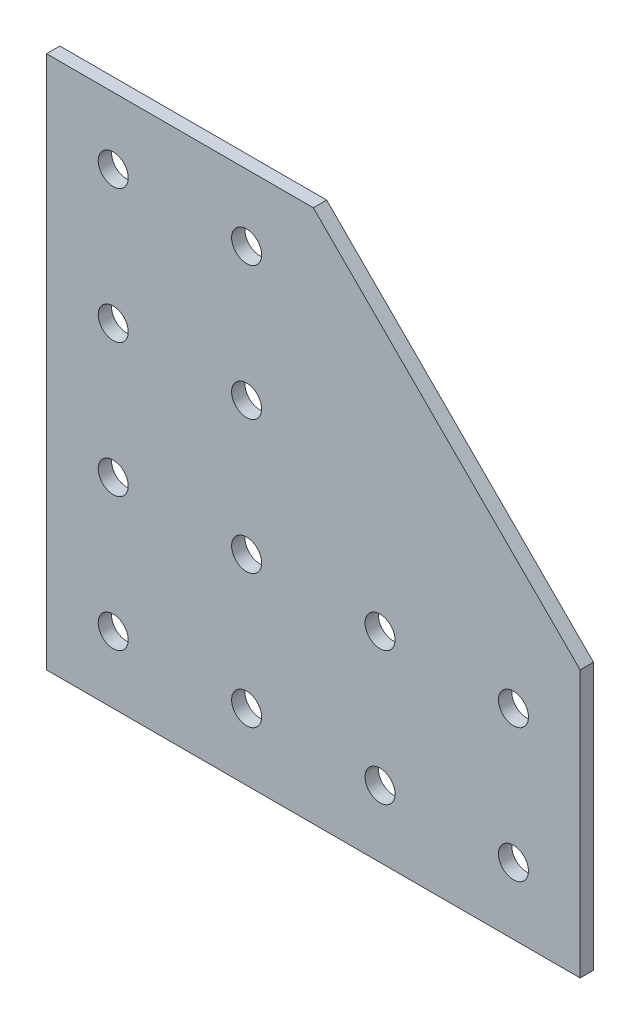
ISO-10303-21;
HEADER;
FILE_DESCRIPTION(('STEP AP214'),'2;1');
FILE_NAME('part.step','',(''),(''),'','','');
FILE_SCHEMA(('AUTOMOTIVE_DESIGN { 1 0 10303 214 1 1 1 1 }'));
ENDSEC;
DATA;
#1=APPLICATION_CONTEXT('core data for automotive mechanical design processes');
#2=APPLICATION_PROTOCOL_DEFINITION('international standard','automotive_design',2000,#1);
#3=PRODUCT_CONTEXT('',#1,'mechanical');
#4=PRODUCT('Part','Part','',(#3));
#5=PRODUCT_RELATED_PRODUCT_CATEGORY('part','',(#4));
#6=PRODUCT_DEFINITION_FORMATION('','',#4);
#7=PRODUCT_DEFINITION_CONTEXT('part definition',#1,'design');
#8=PRODUCT_DEFINITION('design','',#6,#7);
#9=PRODUCT_DEFINITION_SHAPE('','',#8);
#10=(LENGTH_UNIT() NAMED_UNIT(*) SI_UNIT(.MILLI.,.METRE.));
#11=(NAMED_UNIT(*) PLANE_ANGLE_UNIT() SI_UNIT($,.RADIAN.));
#12=(NAMED_UNIT(*) SI_UNIT($,.STERADIAN.) SOLID_ANGLE_UNIT());
#13=UNCERTAINTY_MEASURE_WITH_UNIT(LENGTH_MEASURE(1.E-05),#10,'distance_accuracy_value','');
#14=(GEOMETRIC_REPRESENTATION_CONTEXT(3) GLOBAL_UNCERTAINTY_ASSIGNED_CONTEXT((#13)) GLOBAL_UNIT_ASSIGNED_CONTEXT((#10,
#11,#12)) REPRESENTATION_CONTEXT('',''));
#15=CARTESIAN_POINT('',(0.,0.,0.));
#16=DIRECTION('',(0.,0.,1.));
#17=DIRECTION('',(1.,0.,0.));
#18=AXIS2_PLACEMENT_3D('',#15,#16,#17);
#19=CARTESIAN_POINT('',(80.,0.,2.));
#20=DIRECTION('',(0.,1.,0.));
#21=DIRECTION('',(-1.,0.,0.));
#22=AXIS2_PLACEMENT_3D('',#19,#20,#21);
#23=PLANE('',#22);
#24=DIRECTION('',(1.,0.,0.));
#25=VECTOR('',#24,1.);
#26=CARTESIAN_POINT('',(80.,0.,0.));
#27=LINE('',#26,#25);
#28=CARTESIAN_POINT('',(0.,0.,0.));
#29=VERTEX_POINT('',#28);
#30=CARTESIAN_POINT('',(80.,0.,0.));
#31=VERTEX_POINT('',#30);
#32=EDGE_CURVE('E108',#29,#31,#27,.T.);
#33=ORIENTED_EDGE('',*,*,#32,.T.);
#34=DIRECTION('',(0.,0.,-1.));
#35=VECTOR('',#34,1.);
#36=CARTESIAN_POINT('',(80.,0.,2.));
#37=LINE('',#36,#35);
#38=CARTESIAN_POINT('',(80.,0.,2.));
#39=VERTEX_POINT('',#38);
#40=EDGE_CURVE('E11',#39,#31,#37,.T.);
#41=ORIENTED_EDGE('',*,*,#40,.F.);
#42=DIRECTION('',(1.,0.,0.));
#43=VECTOR('',#42,1.);
#44=CARTESIAN_POINT('',(80.,0.,2.));
#45=LINE('',#44,#43);
#46=CARTESIAN_POINT('',(0.,0.,2.));
#47=VERTEX_POINT('',#46);
#48=EDGE_CURVE('E117',#47,#39,#45,.T.);
#49=ORIENTED_EDGE('',*,*,#48,.F.);
#50=DIRECTION('',(0.,0.,-1.));
#51=VECTOR('',#50,1.);
#52=CARTESIAN_POINT('',(0.,0.,2.));
#53=LINE('',#52,#51);
#54=EDGE_CURVE('E104',#47,#29,#53,.T.);
#55=ORIENTED_EDGE('',*,*,#54,.T.);
#56=EDGE_LOOP('',(#33,#41,#49,#55));
#57=FACE_BOUND('',#56,.T.);
#58=ADVANCED_FACE('F34',(#57),#23,.F.);
#59=CARTESIAN_POINT('',(80.,40.,2.));
#60=DIRECTION('',(-1.,0.,0.));
#61=DIRECTION('',(0.,0.,1.));
#62=AXIS2_PLACEMENT_3D('',#59,#60,#61);
#63=PLANE('',#62);
#64=DIRECTION('',(0.,1.,0.));
#65=VECTOR('',#64,1.);
#66=CARTESIAN_POINT('',(80.,40.,0.));
#67=LINE('',#66,#65);
#68=CARTESIAN_POINT('',(80.,40.,0.));
#69=VERTEX_POINT('',#68);
#70=EDGE_CURVE('E111',#31,#69,#67,.T.);
#71=ORIENTED_EDGE('',*,*,#70,.T.);
#72=DIRECTION('',(0.,0.,-1.));
#73=VECTOR('',#72,1.);
#74=CARTESIAN_POINT('',(80.,40.,2.));
#75=LINE('',#74,#73);
#76=CARTESIAN_POINT('',(80.,40.,2.));
#77=VERTEX_POINT('',#76);
#78=EDGE_CURVE('E42',#77,#69,#75,.T.);
#79=ORIENTED_EDGE('',*,*,#78,.F.);
#80=DIRECTION('',(0.,1.,0.));
#81=VECTOR('',#80,1.);
#82=CARTESIAN_POINT('',(80.,40.,2.));
#83=LINE('',#82,#81);
#84=EDGE_CURVE('E84',#39,#77,#83,.T.);
#85=ORIENTED_EDGE('',*,*,#84,.F.);
#86=ORIENTED_EDGE('',*,*,#40,.T.);
#87=EDGE_LOOP('',(#71,#79,#85,#86));
#88=FACE_BOUND('',#87,.T.);
#89=ADVANCED_FACE('F137',(#88),#63,.F.);
#90=CARTESIAN_POINT('',(40.,80.,2.));
#91=DIRECTION('',(-0.707106781186547,-0.707106781186547,0.));
#92=DIRECTION('',(0.707106781186548,-0.707106781186548,0.));
#93=AXIS2_PLACEMENT_3D('',#90,#91,#92);
#94=PLANE('',#93);
#95=DIRECTION('',(-0.707106781186548,0.707106781186548,0.));
#96=VECTOR('',#95,1.);
#97=CARTESIAN_POINT('',(40.,80.,0.));
#98=LINE('',#97,#96);
#99=CARTESIAN_POINT('',(40.,80.,0.));
#100=VERTEX_POINT('',#99);
#101=EDGE_CURVE('E99',#69,#100,#98,.T.);
#102=ORIENTED_EDGE('',*,*,#101,.T.);
#103=DIRECTION('',(0.,0.,-1.));
#104=VECTOR('',#103,1.);
#105=CARTESIAN_POINT('',(40.,80.,2.));
#106=LINE('',#105,#104);
#107=CARTESIAN_POINT('',(40.,80.,2.));
#108=VERTEX_POINT('',#107);
#109=EDGE_CURVE('E96',#108,#100,#106,.T.);
#110=ORIENTED_EDGE('',*,*,#109,.F.);
#111=DIRECTION('',(-0.707106781186548,0.707106781186548,0.));
#112=VECTOR('',#111,1.);
#113=CARTESIAN_POINT('',(40.,80.,2.));
#114=LINE('',#113,#112);
#115=EDGE_CURVE('E88',#77,#108,#114,.T.);
#116=ORIENTED_EDGE('',*,*,#115,.F.);
#117=ORIENTED_EDGE('',*,*,#78,.T.);
#118=EDGE_LOOP('',(#102,#110,#116,#117));
#119=FACE_BOUND('',#118,.T.);
#120=ADVANCED_FACE('F97',(#119),#94,.F.);
#121=CARTESIAN_POINT('',(0.,80.,2.));
#122=DIRECTION('',(0.,-1.,0.));
#123=DIRECTION('',(0.,0.,-1.));
#124=AXIS2_PLACEMENT_3D('',#121,#122,#123);
#125=PLANE('',#124);
#126=DIRECTION('',(-1.,0.,0.));
#127=VECTOR('',#126,1.);
#128=CARTESIAN_POINT('',(0.,80.,0.));
#129=LINE('',#128,#127);
#130=CARTESIAN_POINT('',(0.,80.,0.));
#131=VERTEX_POINT('',#130);
#132=EDGE_CURVE('E70',#100,#131,#129,.T.);
#133=ORIENTED_EDGE('',*,*,#132,.T.);
#134=DIRECTION('',(0.,0.,-1.));
#135=VECTOR('',#134,1.);
#136=CARTESIAN_POINT('',(0.,80.,2.));
#137=LINE('',#136,#135);
#138=CARTESIAN_POINT('',(0.,80.,2.));
#139=VERTEX_POINT('',#138);
#140=EDGE_CURVE('E100',#139,#131,#137,.T.);
#141=ORIENTED_EDGE('',*,*,#140,.F.);
#142=DIRECTION('',(-1.,0.,0.));
#143=VECTOR('',#142,1.);
#144=CARTESIAN_POINT('',(0.,80.,2.));
#145=LINE('',#144,#143);
#146=EDGE_CURVE('E92',#108,#139,#145,.T.);
#147=ORIENTED_EDGE('',*,*,#146,.F.);
#148=ORIENTED_EDGE('',*,*,#109,.T.);
#149=EDGE_LOOP('',(#133,#141,#147,#148));
#150=FACE_BOUND('',#149,.T.);
#151=ADVANCED_FACE('F102',(#150),#125,.F.);
#152=CARTESIAN_POINT('',(0.,0.,2.));
#153=DIRECTION('',(1.,0.,0.));
#154=DIRECTION('',(0.,0.,-1.));
#155=AXIS2_PLACEMENT_3D('',#152,#153,#154);
#156=PLANE('',#155);
#157=DIRECTION('',(0.,-1.,0.));
#158=VECTOR('',#157,1.);
#159=CARTESIAN_POINT('',(0.,0.,0.));
#160=LINE('',#159,#158);
#161=EDGE_CURVE('E76',#131,#29,#160,.T.);
#162=ORIENTED_EDGE('',*,*,#161,.T.);
#163=ORIENTED_EDGE('',*,*,#54,.F.);
#164=DIRECTION('',(0.,-1.,0.));
#165=VECTOR('',#164,1.);
#166=CARTESIAN_POINT('',(0.,0.,2.));
#167=LINE('',#166,#165);
#168=EDGE_CURVE('E50',#139,#47,#167,.T.);
#169=ORIENTED_EDGE('',*,*,#168,.F.);
#170=ORIENTED_EDGE('',*,*,#140,.T.);
#171=EDGE_LOOP('',(#162,#163,#169,#170));
#172=FACE_BOUND('',#171,.T.);
#173=ADVANCED_FACE('F125',(#172),#156,.F.);
#174=CARTESIAN_POINT('',(0.,0.,2.));
#175=DIRECTION('',(0.,0.,-1.));
#176=DIRECTION('',(-1.,0.,0.));
#177=AXIS2_PLACEMENT_3D('',#174,#175,#176);
#178=PLANE('',#177);
#179=CARTESIAN_POINT('',(70.,10.,2.));
#180=DIRECTION('',(0.,0.,-1.));
#181=DIRECTION('',(-1.,0.,0.));
#182=AXIS2_PLACEMENT_3D('',#179,#180,#181);
#183=CIRCLE('',#182,2.25);
#184=CARTESIAN_POINT('',(67.75,10.,2.));
#185=VERTEX_POINT('',#184);
#186=EDGE_CURVE('E299',#185,#185,#183,.T.);
#187=ORIENTED_EDGE('',*,*,#186,.T.);
#188=EDGE_LOOP('',(#187));
#189=FACE_BOUND('',#188,.T.);
#190=CARTESIAN_POINT('',(30.,50.,2.));
#191=DIRECTION('',(0.,0.,-1.));
#192=DIRECTION('',(-1.,0.,0.));
#193=AXIS2_PLACEMENT_3D('',#190,#191,#192);
#194=CIRCLE('',#193,2.25);
#195=CARTESIAN_POINT('',(27.75,50.,2.));
#196=VERTEX_POINT('',#195);
#197=EDGE_CURVE('E303',#196,#196,#194,.T.);
#198=ORIENTED_EDGE('',*,*,#197,.T.);
#199=EDGE_LOOP('',(#198));
#200=FACE_BOUND('',#199,.T.);
#201=CARTESIAN_POINT('',(50.,10.,2.));
#202=DIRECTION('',(0.,0.,-1.));
#203=DIRECTION('',(-1.,0.,0.));
#204=AXIS2_PLACEMENT_3D('',#201,#202,#203);
#205=CIRCLE('',#204,2.25);
#206=CARTESIAN_POINT('',(47.75,10.,2.));
#207=VERTEX_POINT('',#206);
#208=EDGE_CURVE('E312',#207,#207,#205,.T.);
#209=ORIENTED_EDGE('',*,*,#208,.T.);
#210=EDGE_LOOP('',(#209));
#211=FACE_BOUND('',#210,.T.);
#212=CARTESIAN_POINT('',(10.,50.,2.));
#213=DIRECTION('',(0.,0.,-1.));
#214=DIRECTION('',(-1.,0.,0.));
#215=AXIS2_PLACEMENT_3D('',#212,#213,#214);
#216=CIRCLE('',#215,2.25);
#217=CARTESIAN_POINT('',(7.75,50.,2.));
#218=VERTEX_POINT('',#217);
#219=EDGE_CURVE('E318',#218,#218,#216,.T.);
#220=ORIENTED_EDGE('',*,*,#219,.T.);
#221=EDGE_LOOP('',(#220));
#222=FACE_BOUND('',#221,.T.);
#223=CARTESIAN_POINT('',(70.,30.,2.));
#224=DIRECTION('',(0.,0.,-1.));
#225=DIRECTION('',(-1.,0.,0.));
#226=AXIS2_PLACEMENT_3D('',#223,#224,#225);
#227=CIRCLE('',#226,2.25);
#228=CARTESIAN_POINT('',(67.75,30.,2.));
#229=VERTEX_POINT('',#228);
#230=EDGE_CURVE('E324',#229,#229,#227,.T.);
#231=ORIENTED_EDGE('',*,*,#230,.T.);
#232=EDGE_LOOP('',(#231));
#233=FACE_BOUND('',#232,.T.);
#234=CARTESIAN_POINT('',(30.,70.,2.));
#235=DIRECTION('',(0.,0.,-1.));
#236=DIRECTION('',(-1.,0.,0.));
#237=AXIS2_PLACEMENT_3D('',#234,#235,#236);
#238=CIRCLE('',#237,2.25);
#239=CARTESIAN_POINT('',(27.75,70.,2.));
#240=VERTEX_POINT('',#239);
#241=EDGE_CURVE('E330',#240,#240,#238,.T.);
#242=ORIENTED_EDGE('',*,*,#241,.T.);
#243=EDGE_LOOP('',(#242));
#244=FACE_BOUND('',#243,.T.);
#245=CARTESIAN_POINT('',(10.,70.,2.));
#246=DIRECTION('',(0.,0.,-1.));
#247=DIRECTION('',(-1.,0.,0.));
#248=AXIS2_PLACEMENT_3D('',#245,#246,#247);
#249=CIRCLE('',#248,2.25);
#250=CARTESIAN_POINT('',(7.75,70.,2.));
#251=VERTEX_POINT('',#250);
#252=EDGE_CURVE('E336',#251,#251,#249,.T.);
#253=ORIENTED_EDGE('',*,*,#252,.T.);
#254=EDGE_LOOP('',(#253));
#255=FACE_BOUND('',#254,.T.);
#256=CARTESIAN_POINT('',(30.,10.,2.));
#257=DIRECTION('',(0.,0.,-1.));
#258=DIRECTION('',(-1.,0.,0.));
#259=AXIS2_PLACEMENT_3D('',#256,#257,#258);
#260=CIRCLE('',#259,2.25);
#261=CARTESIAN_POINT('',(27.75,10.,2.));
#262=VERTEX_POINT('',#261);
#263=EDGE_CURVE('E342',#262,#262,#260,.T.);
#264=ORIENTED_EDGE('',*,*,#263,.T.);
#265=EDGE_LOOP('',(#264));
#266=FACE_BOUND('',#265,.T.);
#267=CARTESIAN_POINT('',(10.,10.,2.));
#268=DIRECTION('',(0.,0.,-1.));
#269=DIRECTION('',(-1.,0.,0.));
#270=AXIS2_PLACEMENT_3D('',#267,#268,#269);
#271=CIRCLE('',#270,2.25);
#272=CARTESIAN_POINT('',(7.75000000000001,10.,2.));
#273=VERTEX_POINT('',#272);
#274=EDGE_CURVE('E348',#273,#273,#271,.T.);
#275=ORIENTED_EDGE('',*,*,#274,.T.);
#276=EDGE_LOOP('',(#275));
#277=FACE_BOUND('',#276,.T.);
#278=CARTESIAN_POINT('',(50.,30.,2.));
#279=DIRECTION('',(0.,0.,-1.));
#280=DIRECTION('',(-1.,0.,0.));
#281=AXIS2_PLACEMENT_3D('',#278,#279,#280);
#282=CIRCLE('',#281,2.25);
#283=CARTESIAN_POINT('',(47.75,30.,2.));
#284=VERTEX_POINT('',#283);
#285=EDGE_CURVE('E354',#284,#284,#282,.T.);
#286=ORIENTED_EDGE('',*,*,#285,.T.);
#287=EDGE_LOOP('',(#286));
#288=FACE_BOUND('',#287,.T.);
#289=CARTESIAN_POINT('',(30.,30.,2.));
#290=DIRECTION('',(0.,0.,-1.));
#291=DIRECTION('',(-1.,0.,0.));
#292=AXIS2_PLACEMENT_3D('',#289,#290,#291);
#293=CIRCLE('',#292,2.25);
#294=CARTESIAN_POINT('',(27.75,30.,2.));
#295=VERTEX_POINT('',#294);
#296=EDGE_CURVE('E360',#295,#295,#293,.T.);
#297=ORIENTED_EDGE('',*,*,#296,.T.);
#298=EDGE_LOOP('',(#297));
#299=FACE_BOUND('',#298,.T.);
#300=CARTESIAN_POINT('',(10.,30.,2.));
#301=DIRECTION('',(0.,0.,-1.));
#302=DIRECTION('',(-1.,0.,0.));
#303=AXIS2_PLACEMENT_3D('',#300,#301,#302);
#304=CIRCLE('',#303,2.25);
#305=CARTESIAN_POINT('',(7.75000000000001,30.,2.));
#306=VERTEX_POINT('',#305);
#307=EDGE_CURVE('E112',#306,#306,#304,.T.);
#308=ORIENTED_EDGE('',*,*,#307,.T.);
#309=EDGE_LOOP('',(#308));
#310=FACE_BOUND('',#309,.T.);
#311=ORIENTED_EDGE('',*,*,#48,.T.);
#312=ORIENTED_EDGE('',*,*,#84,.T.);
#313=ORIENTED_EDGE('',*,*,#115,.T.);
#314=ORIENTED_EDGE('',*,*,#146,.T.);
#315=ORIENTED_EDGE('',*,*,#168,.T.);
#316=EDGE_LOOP('',(#311,#312,#313,#314,#315));
#317=FACE_BOUND('',#316,.T.);
#318=ADVANCED_FACE('F90',(#189,#200,#211,#222,#233,#244,#255,#266,#277,#288,#299,#310,#317),
#178,.F.);
#319=CARTESIAN_POINT('',(0.,0.,0.));
#320=DIRECTION('',(0.,0.,-1.));
#321=DIRECTION('',(-1.,0.,0.));
#322=AXIS2_PLACEMENT_3D('',#319,#320,#321);
#323=PLANE('',#322);
#324=CARTESIAN_POINT('',(70.,10.,0.));
#325=DIRECTION('',(0.,0.,-1.));
#326=DIRECTION('',(-1.,0.,0.));
#327=AXIS2_PLACEMENT_3D('',#324,#325,#326);
#328=CIRCLE('',#327,2.25);
#329=CARTESIAN_POINT('',(67.75,10.,0.));
#330=VERTEX_POINT('',#329);
#331=EDGE_CURVE('E296',#330,#330,#328,.T.);
#332=ORIENTED_EDGE('',*,*,#331,.F.);
#333=EDGE_LOOP('',(#332));
#334=FACE_BOUND('',#333,.T.);
#335=CARTESIAN_POINT('',(30.,50.,0.));
#336=DIRECTION('',(0.,0.,-1.));
#337=DIRECTION('',(-1.,0.,0.));
#338=AXIS2_PLACEMENT_3D('',#335,#336,#337);
#339=CIRCLE('',#338,2.25);
#340=CARTESIAN_POINT('',(27.75,50.,0.));
#341=VERTEX_POINT('',#340);
#342=EDGE_CURVE('E300',#341,#341,#339,.T.);
#343=ORIENTED_EDGE('',*,*,#342,.F.);
#344=EDGE_LOOP('',(#343));
#345=FACE_BOUND('',#344,.T.);
#346=CARTESIAN_POINT('',(50.,10.,0.));
#347=DIRECTION('',(0.,0.,-1.));
#348=DIRECTION('',(-1.,0.,0.));
#349=AXIS2_PLACEMENT_3D('',#346,#347,#348);
#350=CIRCLE('',#349,2.25);
#351=CARTESIAN_POINT('',(47.75,10.,0.));
#352=VERTEX_POINT('',#351);
#353=EDGE_CURVE('E309',#352,#352,#350,.T.);
#354=ORIENTED_EDGE('',*,*,#353,.F.);
#355=EDGE_LOOP('',(#354));
#356=FACE_BOUND('',#355,.T.);
#357=CARTESIAN_POINT('',(10.,50.,0.));
#358=DIRECTION('',(0.,0.,-1.));
#359=DIRECTION('',(-1.,0.,0.));
#360=AXIS2_PLACEMENT_3D('',#357,#358,#359);
#361=CIRCLE('',#360,2.25);
#362=CARTESIAN_POINT('',(7.75,50.,0.));
#363=VERTEX_POINT('',#362);
#364=EDGE_CURVE('E315',#363,#363,#361,.T.);
#365=ORIENTED_EDGE('',*,*,#364,.F.);
#366=EDGE_LOOP('',(#365));
#367=FACE_BOUND('',#366,.T.);
#368=CARTESIAN_POINT('',(70.,30.,0.));
#369=DIRECTION('',(0.,0.,-1.));
#370=DIRECTION('',(-1.,0.,0.));
#371=AXIS2_PLACEMENT_3D('',#368,#369,#370);
#372=CIRCLE('',#371,2.25);
#373=CARTESIAN_POINT('',(67.75,30.,0.));
#374=VERTEX_POINT('',#373);
#375=EDGE_CURVE('E321',#374,#374,#372,.T.);
#376=ORIENTED_EDGE('',*,*,#375,.F.);
#377=EDGE_LOOP('',(#376));
#378=FACE_BOUND('',#377,.T.);
#379=CARTESIAN_POINT('',(30.,70.,0.));
#380=DIRECTION('',(0.,0.,-1.));
#381=DIRECTION('',(-1.,0.,0.));
#382=AXIS2_PLACEMENT_3D('',#379,#380,#381);
#383=CIRCLE('',#382,2.25);
#384=CARTESIAN_POINT('',(27.75,70.,0.));
#385=VERTEX_POINT('',#384);
#386=EDGE_CURVE('E327',#385,#385,#383,.T.);
#387=ORIENTED_EDGE('',*,*,#386,.F.);
#388=EDGE_LOOP('',(#387));
#389=FACE_BOUND('',#388,.T.);
#390=CARTESIAN_POINT('',(10.,70.,0.));
#391=DIRECTION('',(0.,0.,-1.));
#392=DIRECTION('',(-1.,0.,0.));
#393=AXIS2_PLACEMENT_3D('',#390,#391,#392);
#394=CIRCLE('',#393,2.25);
#395=CARTESIAN_POINT('',(7.75,70.,0.));
#396=VERTEX_POINT('',#395);
#397=EDGE_CURVE('E333',#396,#396,#394,.T.);
#398=ORIENTED_EDGE('',*,*,#397,.F.);
#399=EDGE_LOOP('',(#398));
#400=FACE_BOUND('',#399,.T.);
#401=CARTESIAN_POINT('',(30.,10.,0.));
#402=DIRECTION('',(0.,0.,-1.));
#403=DIRECTION('',(-1.,0.,0.));
#404=AXIS2_PLACEMENT_3D('',#401,#402,#403);
#405=CIRCLE('',#404,2.25);
#406=CARTESIAN_POINT('',(27.75,10.,0.));
#407=VERTEX_POINT('',#406);
#408=EDGE_CURVE('E339',#407,#407,#405,.T.);
#409=ORIENTED_EDGE('',*,*,#408,.F.);
#410=EDGE_LOOP('',(#409));
#411=FACE_BOUND('',#410,.T.);
#412=CARTESIAN_POINT('',(10.,10.,0.));
#413=DIRECTION('',(0.,0.,-1.));
#414=DIRECTION('',(-1.,0.,0.));
#415=AXIS2_PLACEMENT_3D('',#412,#413,#414);
#416=CIRCLE('',#415,2.25);
#417=CARTESIAN_POINT('',(7.75000000000001,10.,0.));
#418=VERTEX_POINT('',#417);
#419=EDGE_CURVE('E345',#418,#418,#416,.T.);
#420=ORIENTED_EDGE('',*,*,#419,.F.);
#421=EDGE_LOOP('',(#420));
#422=FACE_BOUND('',#421,.T.);
#423=CARTESIAN_POINT('',(50.,30.,0.));
#424=DIRECTION('',(0.,0.,-1.));
#425=DIRECTION('',(-1.,0.,0.));
#426=AXIS2_PLACEMENT_3D('',#423,#424,#425);
#427=CIRCLE('',#426,2.25);
#428=CARTESIAN_POINT('',(47.75,30.,0.));
#429=VERTEX_POINT('',#428);
#430=EDGE_CURVE('E351',#429,#429,#427,.T.);
#431=ORIENTED_EDGE('',*,*,#430,.F.);
#432=EDGE_LOOP('',(#431));
#433=FACE_BOUND('',#432,.T.);
#434=CARTESIAN_POINT('',(30.,30.,0.));
#435=DIRECTION('',(0.,0.,-1.));
#436=DIRECTION('',(-1.,0.,0.));
#437=AXIS2_PLACEMENT_3D('',#434,#435,#436);
#438=CIRCLE('',#437,2.25);
#439=CARTESIAN_POINT('',(27.75,30.,0.));
#440=VERTEX_POINT('',#439);
#441=EDGE_CURVE('E357',#440,#440,#438,.T.);
#442=ORIENTED_EDGE('',*,*,#441,.F.);
#443=EDGE_LOOP('',(#442));
#444=FACE_BOUND('',#443,.T.);
#445=CARTESIAN_POINT('',(10.,30.,0.));
#446=DIRECTION('',(0.,0.,-1.));
#447=DIRECTION('',(-1.,0.,0.));
#448=AXIS2_PLACEMENT_3D('',#445,#446,#447);
#449=CIRCLE('',#448,2.25);
#450=CARTESIAN_POINT('',(7.75000000000001,30.,0.));
#451=VERTEX_POINT('',#450);
#452=EDGE_CURVE('E363',#451,#451,#449,.T.);
#453=ORIENTED_EDGE('',*,*,#452,.F.);
#454=EDGE_LOOP('',(#453));
#455=FACE_BOUND('',#454,.T.);
#456=ORIENTED_EDGE('',*,*,#32,.F.);
#457=ORIENTED_EDGE('',*,*,#161,.F.);
#458=ORIENTED_EDGE('',*,*,#132,.F.);
#459=ORIENTED_EDGE('',*,*,#101,.F.);
#460=ORIENTED_EDGE('',*,*,#70,.F.);
#461=EDGE_LOOP('',(#456,#457,#458,#459,#460));
#462=FACE_BOUND('',#461,.T.);
#463=ADVANCED_FACE('F121',(#334,#345,#356,#367,#378,#389,#400,#411,#422,#433,#444,#455,#462),
#323,.T.);
#464=CARTESIAN_POINT('',(10.,30.,0.));
#465=DIRECTION('',(0.,0.,-1.));
#466=DIRECTION('',(-1.,0.,0.));
#467=AXIS2_PLACEMENT_3D('',#464,#465,#466);
#468=CYLINDRICAL_SURFACE('',#467,2.25);
#469=ORIENTED_EDGE('',*,*,#452,.T.);
#470=EDGE_LOOP('',(#469));
#471=FACE_BOUND('',#470,.T.);
#472=ORIENTED_EDGE('',*,*,#307,.F.);
#473=EDGE_LOOP('',(#472));
#474=FACE_BOUND('',#473,.T.);
#475=ADVANCED_FACE('F170',(#471,#474),#468,.F.);
#476=CARTESIAN_POINT('',(30.,30.,0.));
#477=DIRECTION('',(0.,0.,-1.));
#478=DIRECTION('',(-1.,0.,0.));
#479=AXIS2_PLACEMENT_3D('',#476,#477,#478);
#480=CYLINDRICAL_SURFACE('',#479,2.25);
#481=ORIENTED_EDGE('',*,*,#441,.T.);
#482=EDGE_LOOP('',(#481));
#483=FACE_BOUND('',#482,.T.);
#484=ORIENTED_EDGE('',*,*,#296,.F.);
#485=EDGE_LOOP('',(#484));
#486=FACE_BOUND('',#485,.T.);
#487=ADVANCED_FACE('F179',(#483,#486),#480,.F.);
#488=CARTESIAN_POINT('',(50.,30.,0.));
#489=DIRECTION('',(0.,0.,-1.));
#490=DIRECTION('',(-1.,0.,0.));
#491=AXIS2_PLACEMENT_3D('',#488,#489,#490);
#492=CYLINDRICAL_SURFACE('',#491,2.25);
#493=ORIENTED_EDGE('',*,*,#430,.T.);
#494=EDGE_LOOP('',(#493));
#495=FACE_BOUND('',#494,.T.);
#496=ORIENTED_EDGE('',*,*,#285,.F.);
#497=EDGE_LOOP('',(#496));
#498=FACE_BOUND('',#497,.T.);
#499=ADVANCED_FACE('F189',(#495,#498),#492,.F.);
#500=CARTESIAN_POINT('',(10.,10.,0.));
#501=DIRECTION('',(0.,0.,-1.));
#502=DIRECTION('',(-1.,0.,0.));
#503=AXIS2_PLACEMENT_3D('',#500,#501,#502);
#504=CYLINDRICAL_SURFACE('',#503,2.25);
#505=ORIENTED_EDGE('',*,*,#419,.T.);
#506=EDGE_LOOP('',(#505));
#507=FACE_BOUND('',#506,.T.);
#508=ORIENTED_EDGE('',*,*,#274,.F.);
#509=EDGE_LOOP('',(#508));
#510=FACE_BOUND('',#509,.T.);
#511=ADVANCED_FACE('F199',(#507,#510),#504,.F.);
#512=CARTESIAN_POINT('',(30.,10.,0.));
#513=DIRECTION('',(0.,0.,-1.));
#514=DIRECTION('',(-1.,0.,0.));
#515=AXIS2_PLACEMENT_3D('',#512,#513,#514);
#516=CYLINDRICAL_SURFACE('',#515,2.25);
#517=ORIENTED_EDGE('',*,*,#408,.T.);
#518=EDGE_LOOP('',(#517));
#519=FACE_BOUND('',#518,.T.);
#520=ORIENTED_EDGE('',*,*,#263,.F.);
#521=EDGE_LOOP('',(#520));
#522=FACE_BOUND('',#521,.T.);
#523=ADVANCED_FACE('F209',(#519,#522),#516,.F.);
#524=CARTESIAN_POINT('',(10.,70.,0.));
#525=DIRECTION('',(0.,0.,-1.));
#526=DIRECTION('',(-1.,0.,0.));
#527=AXIS2_PLACEMENT_3D('',#524,#525,#526);
#528=CYLINDRICAL_SURFACE('',#527,2.25);
#529=ORIENTED_EDGE('',*,*,#397,.T.);
#530=EDGE_LOOP('',(#529));
#531=FACE_BOUND('',#530,.T.);
#532=ORIENTED_EDGE('',*,*,#252,.F.);
#533=EDGE_LOOP('',(#532));
#534=FACE_BOUND('',#533,.T.);
#535=ADVANCED_FACE('F219',(#531,#534),#528,.F.);
#536=CARTESIAN_POINT('',(30.,70.,0.));
#537=DIRECTION('',(0.,0.,-1.));
#538=DIRECTION('',(-1.,0.,0.));
#539=AXIS2_PLACEMENT_3D('',#536,#537,#538);
#540=CYLINDRICAL_SURFACE('',#539,2.25);
#541=ORIENTED_EDGE('',*,*,#386,.T.);
#542=EDGE_LOOP('',(#541));
#543=FACE_BOUND('',#542,.T.);
#544=ORIENTED_EDGE('',*,*,#241,.F.);
#545=EDGE_LOOP('',(#544));
#546=FACE_BOUND('',#545,.T.);
#547=ADVANCED_FACE('F229',(#543,#546),#540,.F.);
#548=CARTESIAN_POINT('',(70.,30.,0.));
#549=DIRECTION('',(0.,0.,-1.));
#550=DIRECTION('',(-1.,0.,0.));
#551=AXIS2_PLACEMENT_3D('',#548,#549,#550);
#552=CYLINDRICAL_SURFACE('',#551,2.25);
#553=ORIENTED_EDGE('',*,*,#375,.T.);
#554=EDGE_LOOP('',(#553));
#555=FACE_BOUND('',#554,.T.);
#556=ORIENTED_EDGE('',*,*,#230,.F.);
#557=EDGE_LOOP('',(#556));
#558=FACE_BOUND('',#557,.T.);
#559=ADVANCED_FACE('F239',(#555,#558),#552,.F.);
#560=CARTESIAN_POINT('',(10.,50.,0.));
#561=DIRECTION('',(0.,0.,-1.));
#562=DIRECTION('',(-1.,0.,0.));
#563=AXIS2_PLACEMENT_3D('',#560,#561,#562);
#564=CYLINDRICAL_SURFACE('',#563,2.25);
#565=ORIENTED_EDGE('',*,*,#364,.T.);
#566=EDGE_LOOP('',(#565));
#567=FACE_BOUND('',#566,.T.);
#568=ORIENTED_EDGE('',*,*,#219,.F.);
#569=EDGE_LOOP('',(#568));
#570=FACE_BOUND('',#569,.T.);
#571=ADVANCED_FACE('F249',(#567,#570),#564,.F.);
#572=CARTESIAN_POINT('',(50.,10.,0.));
#573=DIRECTION('',(0.,0.,-1.));
#574=DIRECTION('',(-1.,0.,0.));
#575=AXIS2_PLACEMENT_3D('',#572,#573,#574);
#576=CYLINDRICAL_SURFACE('',#575,2.25);
#577=ORIENTED_EDGE('',*,*,#353,.T.);
#578=EDGE_LOOP('',(#577));
#579=FACE_BOUND('',#578,.T.);
#580=ORIENTED_EDGE('',*,*,#208,.F.);
#581=EDGE_LOOP('',(#580));
#582=FACE_BOUND('',#581,.T.);
#583=ADVANCED_FACE('F259',(#579,#582),#576,.F.);
#584=CARTESIAN_POINT('',(30.,50.,0.));
#585=DIRECTION('',(0.,0.,-1.));
#586=DIRECTION('',(-1.,0.,0.));
#587=AXIS2_PLACEMENT_3D('',#584,#585,#586);
#588=CYLINDRICAL_SURFACE('',#587,2.25);
#589=ORIENTED_EDGE('',*,*,#342,.T.);
#590=EDGE_LOOP('',(#589));
#591=FACE_BOUND('',#590,.T.);
#592=ORIENTED_EDGE('',*,*,#197,.F.);
#593=EDGE_LOOP('',(#592));
#594=FACE_BOUND('',#593,.T.);
#595=ADVANCED_FACE('F269',(#591,#594),#588,.F.);
#596=CARTESIAN_POINT('',(70.,10.,0.));
#597=DIRECTION('',(0.,0.,-1.));
#598=DIRECTION('',(-1.,0.,0.));
#599=AXIS2_PLACEMENT_3D('',#596,#597,#598);
#600=CYLINDRICAL_SURFACE('',#599,2.25);
#601=ORIENTED_EDGE('',*,*,#331,.T.);
#602=EDGE_LOOP('',(#601));
#603=FACE_BOUND('',#602,.T.);
#604=ORIENTED_EDGE('',*,*,#186,.F.);
#605=EDGE_LOOP('',(#604));
#606=FACE_BOUND('',#605,.T.);
#607=ADVANCED_FACE('F279',(#603,#606),#600,.F.);
#608=CLOSED_SHELL('',(#58,#89,#120,#151,#173,#318,#463,#475,#487,#499,#511,#523,#535,#547,#559,
#571,#583,#595,#607));
#609=MANIFOLD_SOLID_BREP('B2',#608);
#610=ADVANCED_BREP_SHAPE_REPRESENTATION('',(#18,#609),#14);
#611=SHAPE_DEFINITION_REPRESENTATION(#9,#610);
ENDSEC;
END-ISO-10303-21;
